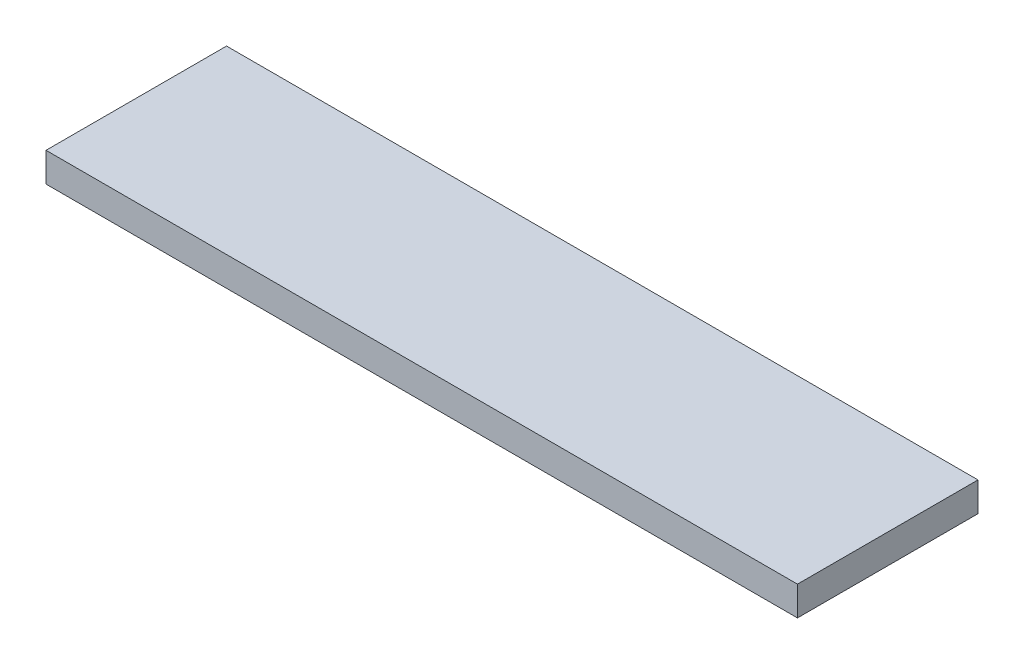
ISO-10303-21;
HEADER;
FILE_DESCRIPTION(('STEP AP214'),'2;1');
FILE_NAME('part.step','',(''),(''),'','','');
FILE_SCHEMA(('AUTOMOTIVE_DESIGN { 1 0 10303 214 1 1 1 1 }'));
ENDSEC;
DATA;
#1=APPLICATION_CONTEXT('core data for automotive mechanical design processes');
#2=APPLICATION_PROTOCOL_DEFINITION('international standard','automotive_design',2000,#1);
#3=PRODUCT_CONTEXT('',#1,'mechanical');
#4=PRODUCT('Part','Part','',(#3));
#5=PRODUCT_RELATED_PRODUCT_CATEGORY('part','',(#4));
#6=PRODUCT_DEFINITION_FORMATION('','',#4);
#7=PRODUCT_DEFINITION_CONTEXT('part definition',#1,'design');
#8=PRODUCT_DEFINITION('design','',#6,#7);
#9=PRODUCT_DEFINITION_SHAPE('','',#8);
#10=(LENGTH_UNIT() NAMED_UNIT(*) SI_UNIT(.MILLI.,.METRE.));
#11=(NAMED_UNIT(*) PLANE_ANGLE_UNIT() SI_UNIT($,.RADIAN.));
#12=(NAMED_UNIT(*) SI_UNIT($,.STERADIAN.) SOLID_ANGLE_UNIT());
#13=UNCERTAINTY_MEASURE_WITH_UNIT(LENGTH_MEASURE(1.E-05),#10,'distance_accuracy_value','');
#14=(GEOMETRIC_REPRESENTATION_CONTEXT(3) GLOBAL_UNCERTAINTY_ASSIGNED_CONTEXT((#13)) GLOBAL_UNIT_ASSIGNED_CONTEXT((#10,
#11,#12)) REPRESENTATION_CONTEXT('',''));
#15=CARTESIAN_POINT('',(0.,0.,0.));
#16=DIRECTION('',(0.,0.,1.));
#17=DIRECTION('',(1.,0.,0.));
#18=AXIS2_PLACEMENT_3D('',#15,#16,#17);
#19=CARTESIAN_POINT('',(-423.690620139312,38.1,-404.215053763441));
#20=DIRECTION('',(1.,0.,0.));
#21=DIRECTION('',(0.,0.,-1.));
#22=AXIS2_PLACEMENT_3D('',#19,#20,#21);
#23=PLANE('',#22);
#24=DIRECTION('',(0.,0.,1.));
#25=VECTOR('',#24,1.);
#26=CARTESIAN_POINT('',(-423.690620139312,0.,-404.215053763441));
#27=LINE('',#26,#25);
#28=CARTESIAN_POINT('',(-423.690620139312,0.,-404.215053763441));
#29=VERTEX_POINT('',#28);
#30=CARTESIAN_POINT('',(-423.690620139312,0.,-169.265053763441));
#31=VERTEX_POINT('',#30);
#32=EDGE_CURVE('E95',#29,#31,#27,.T.);
#33=ORIENTED_EDGE('',*,*,#32,.T.);
#34=DIRECTION('',(0.,-1.,0.));
#35=VECTOR('',#34,1.);
#36=CARTESIAN_POINT('',(-423.690620139312,38.1,-169.265053763441));
#37=LINE('',#36,#35);
#38=CARTESIAN_POINT('',(-423.690620139312,38.1,-169.265053763441));
#39=VERTEX_POINT('',#38);
#40=EDGE_CURVE('E11',#39,#31,#37,.T.);
#41=ORIENTED_EDGE('',*,*,#40,.F.);
#42=DIRECTION('',(0.,0.,1.));
#43=VECTOR('',#42,1.);
#44=CARTESIAN_POINT('',(-423.690620139312,38.1,-404.215053763441));
#45=LINE('',#44,#43);
#46=CARTESIAN_POINT('',(-423.690620139312,38.1,-404.215053763441));
#47=VERTEX_POINT('',#46);
#48=EDGE_CURVE('E81',#47,#39,#45,.T.);
#49=ORIENTED_EDGE('',*,*,#48,.F.);
#50=DIRECTION('',(0.,-1.,0.));
#51=VECTOR('',#50,1.);
#52=CARTESIAN_POINT('',(-423.690620139312,38.1,-404.215053763441));
#53=LINE('',#52,#51);
#54=EDGE_CURVE('E48',#47,#29,#53,.T.);
#55=ORIENTED_EDGE('',*,*,#54,.T.);
#56=EDGE_LOOP('',(#33,#41,#49,#55));
#57=FACE_BOUND('',#56,.T.);
#58=ADVANCED_FACE('F32',(#57),#23,.F.);
#59=CARTESIAN_POINT('',(-423.690620139312,38.1,-169.265053763441));
#60=DIRECTION('',(0.,0.,-1.));
#61=DIRECTION('',(-1.,0.,0.));
#62=AXIS2_PLACEMENT_3D('',#59,#60,#61);
#63=PLANE('',#62);
#64=DIRECTION('',(1.,0.,0.));
#65=VECTOR('',#64,1.);
#66=CARTESIAN_POINT('',(-423.690620139312,0.,-169.265053763441));
#67=LINE('',#66,#65);
#68=CARTESIAN_POINT('',(554.209379860688,0.,-169.265053763441));
#69=VERTEX_POINT('',#68);
#70=EDGE_CURVE('E86',#31,#69,#67,.T.);
#71=ORIENTED_EDGE('',*,*,#70,.T.);
#72=DIRECTION('',(0.,-1.,0.));
#73=VECTOR('',#72,1.);
#74=CARTESIAN_POINT('',(554.209379860688,38.1,-169.265053763441));
#75=LINE('',#74,#73);
#76=CARTESIAN_POINT('',(554.209379860688,38.1,-169.265053763441));
#77=VERTEX_POINT('',#76);
#78=EDGE_CURVE('E40',#77,#69,#75,.T.);
#79=ORIENTED_EDGE('',*,*,#78,.F.);
#80=DIRECTION('',(1.,0.,0.));
#81=VECTOR('',#80,1.);
#82=CARTESIAN_POINT('',(-423.690620139312,38.1,-169.265053763441));
#83=LINE('',#82,#81);
#84=EDGE_CURVE('E73',#39,#77,#83,.T.);
#85=ORIENTED_EDGE('',*,*,#84,.F.);
#86=ORIENTED_EDGE('',*,*,#40,.T.);
#87=EDGE_LOOP('',(#71,#79,#85,#86));
#88=FACE_BOUND('',#87,.T.);
#89=ADVANCED_FACE('F85',(#88),#63,.F.);
#90=CARTESIAN_POINT('',(554.209379860688,38.1,-404.215053763441));
#91=DIRECTION('',(1.,0.,0.));
#92=DIRECTION('',(0.,0.,-1.));
#93=AXIS2_PLACEMENT_3D('',#90,#91,#92);
#94=PLANE('',#93);
#95=DIRECTION('',(0.,0.,1.));
#96=VECTOR('',#95,1.);
#97=CARTESIAN_POINT('',(554.209379860688,0.,-404.215053763441));
#98=LINE('',#97,#96);
#99=CARTESIAN_POINT('',(554.209379860688,0.,-404.215053763441));
#100=VERTEX_POINT('',#99);
#101=EDGE_CURVE('E98',#100,#69,#98,.T.);
#102=ORIENTED_EDGE('',*,*,#101,.F.);
#103=DIRECTION('',(0.,-1.,0.));
#104=VECTOR('',#103,1.);
#105=CARTESIAN_POINT('',(554.209379860688,38.1,-404.215053763441));
#106=LINE('',#105,#104);
#107=CARTESIAN_POINT('',(554.209379860688,38.1,-404.215053763441));
#108=VERTEX_POINT('',#107);
#109=EDGE_CURVE('E62',#108,#100,#106,.T.);
#110=ORIENTED_EDGE('',*,*,#109,.F.);
#111=DIRECTION('',(0.,0.,1.));
#112=VECTOR('',#111,1.);
#113=CARTESIAN_POINT('',(554.209379860688,38.1,-404.215053763441));
#114=LINE('',#113,#112);
#115=EDGE_CURVE('E80',#108,#77,#114,.T.);
#116=ORIENTED_EDGE('',*,*,#115,.T.);
#117=ORIENTED_EDGE('',*,*,#78,.T.);
#118=EDGE_LOOP('',(#102,#110,#116,#117));
#119=FACE_BOUND('',#118,.T.);
#120=ADVANCED_FACE('F89',(#119),#94,.T.);
#121=CARTESIAN_POINT('',(-423.690620139312,38.1,-404.215053763441));
#122=DIRECTION('',(0.,0.,-1.));
#123=DIRECTION('',(-1.,0.,0.));
#124=AXIS2_PLACEMENT_3D('',#121,#122,#123);
#125=PLANE('',#124);
#126=DIRECTION('',(1.,0.,0.));
#127=VECTOR('',#126,1.);
#128=CARTESIAN_POINT('',(-423.690620139312,0.,-404.215053763441));
#129=LINE('',#128,#127);
#130=EDGE_CURVE('E100',#29,#100,#129,.T.);
#131=ORIENTED_EDGE('',*,*,#130,.F.);
#132=ORIENTED_EDGE('',*,*,#54,.F.);
#133=DIRECTION('',(1.,0.,0.));
#134=VECTOR('',#133,1.);
#135=CARTESIAN_POINT('',(-423.690620139312,38.1,-404.215053763441));
#136=LINE('',#135,#134);
#137=EDGE_CURVE('E90',#47,#108,#136,.T.);
#138=ORIENTED_EDGE('',*,*,#137,.T.);
#139=ORIENTED_EDGE('',*,*,#109,.T.);
#140=EDGE_LOOP('',(#131,#132,#138,#139));
#141=FACE_BOUND('',#140,.T.);
#142=ADVANCED_FACE('F106',(#141),#125,.T.);
#143=CARTESIAN_POINT('',(0.,38.1,0.));
#144=DIRECTION('',(0.,1.,0.));
#145=DIRECTION('',(0.,0.,1.));
#146=AXIS2_PLACEMENT_3D('',#143,#144,#145);
#147=PLANE('',#146);
#148=ORIENTED_EDGE('',*,*,#48,.T.);
#149=ORIENTED_EDGE('',*,*,#84,.T.);
#150=ORIENTED_EDGE('',*,*,#115,.F.);
#151=ORIENTED_EDGE('',*,*,#137,.F.);
#152=EDGE_LOOP('',(#148,#149,#150,#151));
#153=FACE_BOUND('',#152,.T.);
#154=ADVANCED_FACE('F77',(#153),#147,.T.);
#155=CARTESIAN_POINT('',(0.,0.,0.));
#156=DIRECTION('',(0.,1.,0.));
#157=DIRECTION('',(0.,0.,1.));
#158=AXIS2_PLACEMENT_3D('',#155,#156,#157);
#159=PLANE('',#158);
#160=ORIENTED_EDGE('',*,*,#32,.F.);
#161=ORIENTED_EDGE('',*,*,#130,.T.);
#162=ORIENTED_EDGE('',*,*,#101,.T.);
#163=ORIENTED_EDGE('',*,*,#70,.F.);
#164=EDGE_LOOP('',(#160,#161,#162,#163));
#165=FACE_BOUND('',#164,.T.);
#166=ADVANCED_FACE('F105',(#165),#159,.F.);
#167=CLOSED_SHELL('',(#58,#89,#120,#142,#154,#166));
#168=MANIFOLD_SOLID_BREP('B2',#167);
#169=ADVANCED_BREP_SHAPE_REPRESENTATION('',(#18,#168),#14);
#170=SHAPE_DEFINITION_REPRESENTATION(#9,#169);
ENDSEC;
END-ISO-10303-21;
